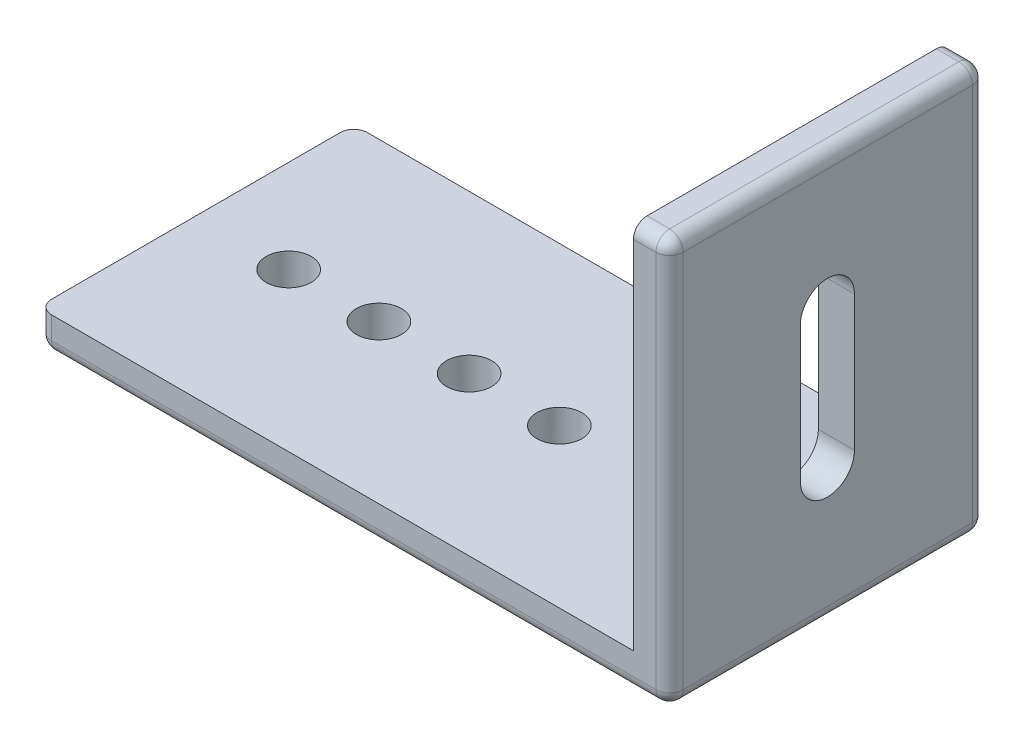
ISO-10303-21;
HEADER;
FILE_DESCRIPTION(('STEP AP214'),'2;1');
FILE_NAME('part.step','',(''),(''),'','','');
FILE_SCHEMA(('AUTOMOTIVE_DESIGN { 1 0 10303 214 1 1 1 1 }'));
ENDSEC;
DATA;
#1=APPLICATION_CONTEXT('core data for automotive mechanical design processes');
#2=APPLICATION_PROTOCOL_DEFINITION('international standard','automotive_design',2000,#1);
#3=PRODUCT_CONTEXT('',#1,'mechanical');
#4=PRODUCT('Part','Part','',(#3));
#5=PRODUCT_RELATED_PRODUCT_CATEGORY('part','',(#4));
#6=PRODUCT_DEFINITION_FORMATION('','',#4);
#7=PRODUCT_DEFINITION_CONTEXT('part definition',#1,'design');
#8=PRODUCT_DEFINITION('design','',#6,#7);
#9=PRODUCT_DEFINITION_SHAPE('','',#8);
#10=(LENGTH_UNIT() NAMED_UNIT(*) SI_UNIT(.MILLI.,.METRE.));
#11=(NAMED_UNIT(*) PLANE_ANGLE_UNIT() SI_UNIT($,.RADIAN.));
#12=(NAMED_UNIT(*) SI_UNIT($,.STERADIAN.) SOLID_ANGLE_UNIT());
#13=UNCERTAINTY_MEASURE_WITH_UNIT(LENGTH_MEASURE(1.E-05),#10,'distance_accuracy_value','');
#14=(GEOMETRIC_REPRESENTATION_CONTEXT(3) GLOBAL_UNCERTAINTY_ASSIGNED_CONTEXT((#13)) GLOBAL_UNIT_ASSIGNED_CONTEXT((#10,
#11,#12)) REPRESENTATION_CONTEXT('',''));
#15=CARTESIAN_POINT('',(0.,0.,0.));
#16=DIRECTION('',(0.,0.,1.));
#17=DIRECTION('',(1.,0.,0.));
#18=AXIS2_PLACEMENT_3D('',#15,#16,#17);
#19=CARTESIAN_POINT('',(70.,8.,35.));
#20=DIRECTION('',(-1.,0.,0.));
#21=DIRECTION('',(0.,0.,1.));
#22=AXIS2_PLACEMENT_3D('',#19,#20,#21);
#23=PLANE('',#22);
#24=DIRECTION('',(0.,-1.,0.));
#25=VECTOR('',#24,1.);
#26=CARTESIAN_POINT('',(70.,60.,6.));
#27=LINE('',#26,#25);
#28=CARTESIAN_POINT('',(70.,60.,6.));
#29=VERTEX_POINT('',#28);
#30=CARTESIAN_POINT('',(70.,30.,5.99999999999999));
#31=VERTEX_POINT('',#30);
#32=EDGE_CURVE('E190',#29,#31,#27,.T.);
#33=ORIENTED_EDGE('',*,*,#32,.F.);
#34=CARTESIAN_POINT('',(70.,60.,0.));
#35=DIRECTION('',(1.,0.,0.));
#36=DIRECTION('',(0.,0.,-1.));
#37=AXIS2_PLACEMENT_3D('',#34,#35,#36);
#38=CIRCLE('',#37,6.);
#39=CARTESIAN_POINT('',(70.,60.,-6.));
#40=VERTEX_POINT('',#39);
#41=EDGE_CURVE('E195',#40,#29,#38,.T.);
#42=ORIENTED_EDGE('',*,*,#41,.F.);
#43=DIRECTION('',(0.,1.,0.));
#44=VECTOR('',#43,1.);
#45=CARTESIAN_POINT('',(70.,60.,-6.));
#46=LINE('',#45,#44);
#47=CARTESIAN_POINT('',(70.,30.,-6.00000000000001));
#48=VERTEX_POINT('',#47);
#49=EDGE_CURVE('E199',#48,#40,#46,.T.);
#50=ORIENTED_EDGE('',*,*,#49,.F.);
#51=CARTESIAN_POINT('',(70.,30.,0.));
#52=DIRECTION('',(1.,0.,0.));
#53=DIRECTION('',(0.,0.,-1.));
#54=AXIS2_PLACEMENT_3D('',#51,#52,#53);
#55=CIRCLE('',#54,6.);
#56=EDGE_CURVE('E179',#31,#48,#55,.T.);
#57=ORIENTED_EDGE('',*,*,#56,.F.);
#58=EDGE_LOOP('',(#33,#42,#50,#57));
#59=FACE_BOUND('',#58,.T.);
#60=DIRECTION('',(0.,0.,1.));
#61=VECTOR('',#60,1.);
#62=CARTESIAN_POINT('',(70.,87.,35.));
#63=LINE('',#62,#61);
#64=CARTESIAN_POINT('',(70.,87.,-32.1580626756818));
#65=VERTEX_POINT('',#64);
#66=CARTESIAN_POINT('',(70.,87.,32.));
#67=VERTEX_POINT('',#66);
#68=EDGE_CURVE('E306',#65,#67,#63,.T.);
#69=ORIENTED_EDGE('',*,*,#68,.T.);
#70=DIRECTION('',(0.,-1.,0.));
#71=VECTOR('',#70,1.);
#72=CARTESIAN_POINT('',(70.,8.,32.));
#73=LINE('',#72,#71);
#74=CARTESIAN_POINT('',(70.,3.,32.));
#75=VERTEX_POINT('',#74);
#76=EDGE_CURVE('E310',#67,#75,#73,.T.);
#77=ORIENTED_EDGE('',*,*,#76,.T.);
#78=DIRECTION('',(0.,0.,-1.));
#79=VECTOR('',#78,1.);
#80=CARTESIAN_POINT('',(70.,3.,-35.1580626756818));
#81=LINE('',#80,#79);
#82=CARTESIAN_POINT('',(70.,3.,-32.1580626756818));
#83=VERTEX_POINT('',#82);
#84=EDGE_CURVE('E238',#75,#83,#81,.T.);
#85=ORIENTED_EDGE('',*,*,#84,.T.);
#86=DIRECTION('',(0.,1.,0.));
#87=VECTOR('',#86,1.);
#88=CARTESIAN_POINT('',(70.,90.,-32.1580626756818));
#89=LINE('',#88,#87);
#90=EDGE_CURVE('E308',#83,#65,#89,.T.);
#91=ORIENTED_EDGE('',*,*,#90,.T.);
#92=EDGE_LOOP('',(#69,#77,#85,#91));
#93=FACE_BOUND('',#92,.T.);
#94=ADVANCED_FACE('F35',(#59,#93),#23,.F.);
#95=CARTESIAN_POINT('',(-70.,8.,-35.));
#96=DIRECTION('',(0.,0.,1.));
#97=DIRECTION('',(1.,0.,0.));
#98=AXIS2_PLACEMENT_3D('',#95,#96,#97);
#99=PLANE('',#98);
#100=DIRECTION('',(-1.,0.,0.));
#101=VECTOR('',#100,1.);
#102=CARTESIAN_POINT('',(-70.,3.,-35.));
#103=LINE('',#102,#101);
#104=CARTESIAN_POINT('',(62.,3.,-35.));
#105=VERTEX_POINT('',#104);
#106=CARTESIAN_POINT('',(-67.,3.,-35.));
#107=VERTEX_POINT('',#106);
#108=EDGE_CURVE('E253',#105,#107,#103,.T.);
#109=ORIENTED_EDGE('',*,*,#108,.T.);
#110=DIRECTION('',(0.,-1.,0.));
#111=VECTOR('',#110,1.);
#112=CARTESIAN_POINT('',(-67.,8.,-35.));
#113=LINE('',#112,#111);
#114=CARTESIAN_POINT('',(-67.,8.,-35.));
#115=VERTEX_POINT('',#114);
#116=EDGE_CURVE('E51',#107,#115,#113,.F.);
#117=ORIENTED_EDGE('',*,*,#116,.T.);
#118=DIRECTION('',(-1.,0.,0.));
#119=VECTOR('',#118,1.);
#120=CARTESIAN_POINT('',(-70.,8.,-35.));
#121=LINE('',#120,#119);
#122=CARTESIAN_POINT('',(62.,8.,-35.));
#123=VERTEX_POINT('',#122);
#124=EDGE_CURVE('E225',#123,#115,#121,.T.);
#125=ORIENTED_EDGE('',*,*,#124,.F.);
#126=DIRECTION('',(0.,-1.,0.));
#127=VECTOR('',#126,1.);
#128=CARTESIAN_POINT('',(62.,8.,-35.));
#129=LINE('',#128,#127);
#130=EDGE_CURVE('E222',#123,#105,#129,.T.);
#131=ORIENTED_EDGE('',*,*,#130,.T.);
#132=EDGE_LOOP('',(#109,#117,#125,#131));
#133=FACE_BOUND('',#132,.T.);
#134=ADVANCED_FACE('F388',(#133),#99,.F.);
#135=CARTESIAN_POINT('',(-70.,8.,35.));
#136=DIRECTION('',(1.,0.,0.));
#137=DIRECTION('',(0.,0.,-1.));
#138=AXIS2_PLACEMENT_3D('',#135,#136,#137);
#139=PLANE('',#138);
#140=DIRECTION('',(0.,0.,1.));
#141=VECTOR('',#140,1.);
#142=CARTESIAN_POINT('',(-70.,8.,35.));
#143=LINE('',#142,#141);
#144=CARTESIAN_POINT('',(-70.,8.,-32.));
#145=VERTEX_POINT('',#144);
#146=CARTESIAN_POINT('',(-70.,8.,32.));
#147=VERTEX_POINT('',#146);
#148=EDGE_CURVE('E227',#145,#147,#143,.T.);
#149=ORIENTED_EDGE('',*,*,#148,.F.);
#150=DIRECTION('',(0.,-1.,0.));
#151=VECTOR('',#150,1.);
#152=CARTESIAN_POINT('',(-70.,8.,-32.));
#153=LINE('',#152,#151);
#154=CARTESIAN_POINT('',(-70.,3.,-32.));
#155=VERTEX_POINT('',#154);
#156=EDGE_CURVE('E312',#145,#155,#153,.T.);
#157=ORIENTED_EDGE('',*,*,#156,.T.);
#158=DIRECTION('',(0.,0.,1.));
#159=VECTOR('',#158,1.);
#160=CARTESIAN_POINT('',(-70.,3.,35.));
#161=LINE('',#160,#159);
#162=CARTESIAN_POINT('',(-70.,3.,32.));
#163=VERTEX_POINT('',#162);
#164=EDGE_CURVE('E255',#155,#163,#161,.T.);
#165=ORIENTED_EDGE('',*,*,#164,.T.);
#166=DIRECTION('',(0.,-1.,0.));
#167=VECTOR('',#166,1.);
#168=CARTESIAN_POINT('',(-70.,8.,32.));
#169=LINE('',#168,#167);
#170=EDGE_CURVE('E295',#163,#147,#169,.F.);
#171=ORIENTED_EDGE('',*,*,#170,.T.);
#172=EDGE_LOOP('',(#149,#157,#165,#171));
#173=FACE_BOUND('',#172,.T.);
#174=ADVANCED_FACE('F369',(#173),#139,.F.);
#175=CARTESIAN_POINT('',(-70.,8.,35.));
#176=DIRECTION('',(0.,0.,-1.));
#177=DIRECTION('',(-1.,0.,0.));
#178=AXIS2_PLACEMENT_3D('',#175,#176,#177);
#179=PLANE('',#178);
#180=DIRECTION('',(1.,0.,0.));
#181=VECTOR('',#180,1.);
#182=CARTESIAN_POINT('',(-70.,8.,35.));
#183=LINE('',#182,#181);
#184=CARTESIAN_POINT('',(-67.,8.,35.));
#185=VERTEX_POINT('',#184);
#186=CARTESIAN_POINT('',(62.,8.,35.));
#187=VERTEX_POINT('',#186);
#188=EDGE_CURVE('E229',#185,#187,#183,.T.);
#189=ORIENTED_EDGE('',*,*,#188,.F.);
#190=DIRECTION('',(0.,-1.,0.));
#191=VECTOR('',#190,1.);
#192=CARTESIAN_POINT('',(-67.,8.,35.));
#193=LINE('',#192,#191);
#194=CARTESIAN_POINT('',(-67.,3.,35.));
#195=VERTEX_POINT('',#194);
#196=EDGE_CURVE('E293',#185,#195,#193,.T.);
#197=ORIENTED_EDGE('',*,*,#196,.T.);
#198=DIRECTION('',(1.,0.,0.));
#199=VECTOR('',#198,1.);
#200=CARTESIAN_POINT('',(70.,3.,35.));
#201=LINE('',#200,#199);
#202=CARTESIAN_POINT('',(67.,3.,35.));
#203=VERTEX_POINT('',#202);
#204=EDGE_CURVE('E257',#195,#203,#201,.T.);
#205=ORIENTED_EDGE('',*,*,#204,.T.);
#206=DIRECTION('',(0.,-1.,0.));
#207=VECTOR('',#206,1.);
#208=CARTESIAN_POINT('',(67.,8.,35.));
#209=LINE('',#208,#207);
#210=CARTESIAN_POINT('',(67.,87.,35.));
#211=VERTEX_POINT('',#210);
#212=EDGE_CURVE('E289',#203,#211,#209,.F.);
#213=ORIENTED_EDGE('',*,*,#212,.T.);
#214=DIRECTION('',(1.,0.,0.));
#215=VECTOR('',#214,1.);
#216=CARTESIAN_POINT('',(62.,87.,35.));
#217=LINE('',#216,#215);
#218=CARTESIAN_POINT('',(62.,87.,35.));
#219=VERTEX_POINT('',#218);
#220=EDGE_CURVE('E291',#211,#219,#217,.F.);
#221=ORIENTED_EDGE('',*,*,#220,.T.);
#222=DIRECTION('',(0.,-1.,0.));
#223=VECTOR('',#222,1.);
#224=CARTESIAN_POINT('',(62.,0.,35.));
#225=LINE('',#224,#223);
#226=EDGE_CURVE('E206',#219,#187,#225,.T.);
#227=ORIENTED_EDGE('',*,*,#226,.T.);
#228=EDGE_LOOP('',(#189,#197,#205,#213,#221,#227));
#229=FACE_BOUND('',#228,.T.);
#230=ADVANCED_FACE('F378',(#229),#179,.F.);
#231=CARTESIAN_POINT('',(0.,8.,0.));
#232=DIRECTION('',(0.,-1.,0.));
#233=DIRECTION('',(0.,0.,-1.));
#234=AXIS2_PLACEMENT_3D('',#231,#232,#233);
#235=PLANE('',#234);
#236=CARTESIAN_POINT('',(-49.4277426908549,8.,0.));
#237=DIRECTION('',(0.,-1.,0.));
#238=DIRECTION('',(0.,0.,-1.));
#239=AXIS2_PLACEMENT_3D('',#236,#237,#238);
#240=CIRCLE('',#239,5.);
#241=CARTESIAN_POINT('',(-49.4277426908549,8.,-5.));
#242=VERTEX_POINT('',#241);
#243=EDGE_CURVE('E732',#242,#242,#240,.T.);
#244=ORIENTED_EDGE('',*,*,#243,.T.);
#245=EDGE_LOOP('',(#244));
#246=FACE_BOUND('',#245,.T.);
#247=CARTESIAN_POINT('',(-29.4277426908549,8.,0.));
#248=DIRECTION('',(0.,-1.,0.));
#249=DIRECTION('',(0.,0.,-1.));
#250=AXIS2_PLACEMENT_3D('',#247,#248,#249);
#251=CIRCLE('',#250,5.);
#252=CARTESIAN_POINT('',(-29.4277426908549,8.,-5.));
#253=VERTEX_POINT('',#252);
#254=EDGE_CURVE('E736',#253,#253,#251,.T.);
#255=ORIENTED_EDGE('',*,*,#254,.T.);
#256=EDGE_LOOP('',(#255));
#257=FACE_BOUND('',#256,.T.);
#258=CARTESIAN_POINT('',(10.5722573091451,8.,0.));
#259=DIRECTION('',(0.,-1.,0.));
#260=DIRECTION('',(0.,0.,-1.));
#261=AXIS2_PLACEMENT_3D('',#258,#259,#260);
#262=CIRCLE('',#261,5.);
#263=CARTESIAN_POINT('',(10.5722573091451,8.,-5.));
#264=VERTEX_POINT('',#263);
#265=EDGE_CURVE('E740',#264,#264,#262,.T.);
#266=ORIENTED_EDGE('',*,*,#265,.T.);
#267=EDGE_LOOP('',(#266));
#268=FACE_BOUND('',#267,.T.);
#269=CARTESIAN_POINT('',(-9.4277426908549,8.,0.));
#270=DIRECTION('',(0.,-1.,0.));
#271=DIRECTION('',(0.,0.,-1.));
#272=AXIS2_PLACEMENT_3D('',#269,#270,#271);
#273=CIRCLE('',#272,5.);
#274=CARTESIAN_POINT('',(-9.4277426908549,8.,-5.));
#275=VERTEX_POINT('',#274);
#276=EDGE_CURVE('E743',#275,#275,#273,.T.);
#277=ORIENTED_EDGE('',*,*,#276,.T.);
#278=EDGE_LOOP('',(#277));
#279=FACE_BOUND('',#278,.T.);
#280=ORIENTED_EDGE('',*,*,#124,.T.);
#281=CARTESIAN_POINT('',(-67.,8.,-32.));
#282=DIRECTION('',(0.,-1.,0.));
#283=DIRECTION('',(0.,0.,-1.));
#284=AXIS2_PLACEMENT_3D('',#281,#282,#283);
#285=CIRCLE('',#284,3.);
#286=EDGE_CURVE('E347',#115,#145,#285,.F.);
#287=ORIENTED_EDGE('',*,*,#286,.T.);
#288=ORIENTED_EDGE('',*,*,#148,.T.);
#289=CARTESIAN_POINT('',(-67.,8.,32.));
#290=DIRECTION('',(0.,-1.,0.));
#291=DIRECTION('',(0.,0.,-1.));
#292=AXIS2_PLACEMENT_3D('',#289,#290,#291);
#293=CIRCLE('',#292,3.);
#294=EDGE_CURVE('E298',#147,#185,#293,.F.);
#295=ORIENTED_EDGE('',*,*,#294,.T.);
#296=ORIENTED_EDGE('',*,*,#188,.T.);
#297=DIRECTION('',(0.,0.,-1.));
#298=VECTOR('',#297,1.);
#299=CARTESIAN_POINT('',(62.,8.,0.));
#300=LINE('',#299,#298);
#301=EDGE_CURVE('E220',#187,#123,#300,.T.);
#302=ORIENTED_EDGE('',*,*,#301,.T.);
#303=EDGE_LOOP('',(#280,#287,#288,#295,#296,#302));
#304=FACE_BOUND('',#303,.T.);
#305=ADVANCED_FACE('F367',(#246,#257,#268,#279,#304),#235,.F.);
#306=CARTESIAN_POINT('',(0.,0.,0.));
#307=DIRECTION('',(0.,-1.,0.));
#308=DIRECTION('',(0.,0.,-1.));
#309=AXIS2_PLACEMENT_3D('',#306,#307,#308);
#310=PLANE('',#309);
#311=CARTESIAN_POINT('',(-49.4277426908549,0.,0.));
#312=DIRECTION('',(0.,1.,0.));
#313=DIRECTION('',(0.,0.,1.));
#314=AXIS2_PLACEMENT_3D('',#311,#312,#313);
#315=CIRCLE('',#314,5.);
#316=CARTESIAN_POINT('',(-49.4277426908549,0.,5.));
#317=VERTEX_POINT('',#316);
#318=EDGE_CURVE('E316',#317,#317,#315,.T.);
#319=ORIENTED_EDGE('',*,*,#318,.T.);
#320=EDGE_LOOP('',(#319));
#321=FACE_BOUND('',#320,.T.);
#322=CARTESIAN_POINT('',(-29.4277426908549,0.,0.));
#323=DIRECTION('',(0.,1.,0.));
#324=DIRECTION('',(0.,0.,1.));
#325=AXIS2_PLACEMENT_3D('',#322,#323,#324);
#326=CIRCLE('',#325,5.);
#327=CARTESIAN_POINT('',(-29.4277426908549,0.,5.));
#328=VERTEX_POINT('',#327);
#329=EDGE_CURVE('E759',#328,#328,#326,.T.);
#330=ORIENTED_EDGE('',*,*,#329,.T.);
#331=EDGE_LOOP('',(#330));
#332=FACE_BOUND('',#331,.T.);
#333=CARTESIAN_POINT('',(10.5722573091451,0.,0.));
#334=DIRECTION('',(0.,1.,0.));
#335=DIRECTION('',(0.,0.,1.));
#336=AXIS2_PLACEMENT_3D('',#333,#334,#335);
#337=CIRCLE('',#336,5.);
#338=CARTESIAN_POINT('',(10.5722573091451,0.,5.));
#339=VERTEX_POINT('',#338);
#340=EDGE_CURVE('E749',#339,#339,#337,.T.);
#341=ORIENTED_EDGE('',*,*,#340,.T.);
#342=EDGE_LOOP('',(#341));
#343=FACE_BOUND('',#342,.T.);
#344=CARTESIAN_POINT('',(-9.4277426908549,0.,0.));
#345=DIRECTION('',(0.,1.,0.));
#346=DIRECTION('',(0.,0.,1.));
#347=AXIS2_PLACEMENT_3D('',#344,#345,#346);
#348=CIRCLE('',#347,5.);
#349=CARTESIAN_POINT('',(-9.4277426908549,0.,5.));
#350=VERTEX_POINT('',#349);
#351=EDGE_CURVE('E745',#350,#350,#348,.T.);
#352=ORIENTED_EDGE('',*,*,#351,.T.);
#353=EDGE_LOOP('',(#352));
#354=FACE_BOUND('',#353,.T.);
#355=DIRECTION('',(0.,0.,-1.));
#356=VECTOR('',#355,1.);
#357=CARTESIAN_POINT('',(62.,0.,35.));
#358=LINE('',#357,#356);
#359=CARTESIAN_POINT('',(62.,0.,-32.));
#360=VERTEX_POINT('',#359);
#361=CARTESIAN_POINT('',(62.,0.,-32.1580626756818));
#362=VERTEX_POINT('',#361);
#363=EDGE_CURVE('E211',#360,#362,#358,.T.);
#364=ORIENTED_EDGE('',*,*,#363,.T.);
#365=DIRECTION('',(1.,0.,0.));
#366=VECTOR('',#365,1.);
#367=CARTESIAN_POINT('',(0.,0.,-32.1580626756818));
#368=LINE('',#367,#366);
#369=CARTESIAN_POINT('',(67.,0.,-32.1580626756818));
#370=VERTEX_POINT('',#369);
#371=EDGE_CURVE('E275',#362,#370,#368,.T.);
#372=ORIENTED_EDGE('',*,*,#371,.T.);
#373=DIRECTION('',(0.,0.,-1.));
#374=VECTOR('',#373,1.);
#375=CARTESIAN_POINT('',(67.,0.,35.));
#376=LINE('',#375,#374);
#377=CARTESIAN_POINT('',(67.,0.,32.));
#378=VERTEX_POINT('',#377);
#379=EDGE_CURVE('E250',#370,#378,#376,.F.);
#380=ORIENTED_EDGE('',*,*,#379,.T.);
#381=DIRECTION('',(1.,0.,0.));
#382=VECTOR('',#381,1.);
#383=CARTESIAN_POINT('',(-70.,0.,32.));
#384=LINE('',#383,#382);
#385=CARTESIAN_POINT('',(-67.,0.,32.));
#386=VERTEX_POINT('',#385);
#387=EDGE_CURVE('E241',#378,#386,#384,.F.);
#388=ORIENTED_EDGE('',*,*,#387,.T.);
#389=DIRECTION('',(0.,0.,1.));
#390=VECTOR('',#389,1.);
#391=CARTESIAN_POINT('',(-67.,0.,-35.));
#392=LINE('',#391,#390);
#393=CARTESIAN_POINT('',(-67.,0.,-32.));
#394=VERTEX_POINT('',#393);
#395=EDGE_CURVE('E244',#386,#394,#392,.F.);
#396=ORIENTED_EDGE('',*,*,#395,.T.);
#397=DIRECTION('',(-1.,0.,0.));
#398=VECTOR('',#397,1.);
#399=CARTESIAN_POINT('',(62.,0.,-32.));
#400=LINE('',#399,#398);
#401=EDGE_CURVE('E247',#394,#360,#400,.F.);
#402=ORIENTED_EDGE('',*,*,#401,.T.);
#403=EDGE_LOOP('',(#364,#372,#380,#388,#396,#402));
#404=FACE_BOUND('',#403,.T.);
#405=ADVANCED_FACE('F357',(#321,#332,#343,#354,#404),#310,.T.);
#406=CARTESIAN_POINT('',(62.,0.,0.));
#407=DIRECTION('',(-1.,0.,0.));
#408=DIRECTION('',(0.,0.,1.));
#409=AXIS2_PLACEMENT_3D('',#406,#407,#408);
#410=PLANE('',#409);
#411=CARTESIAN_POINT('',(62.,60.,0.));
#412=DIRECTION('',(-1.,0.,0.));
#413=DIRECTION('',(0.,0.,1.));
#414=AXIS2_PLACEMENT_3D('',#411,#412,#413);
#415=CIRCLE('',#414,6.);
#416=CARTESIAN_POINT('',(62.,60.,6.));
#417=VERTEX_POINT('',#416);
#418=CARTESIAN_POINT('',(62.,60.,-6.));
#419=VERTEX_POINT('',#418);
#420=EDGE_CURVE('E236',#417,#419,#415,.T.);
#421=ORIENTED_EDGE('',*,*,#420,.F.);
#422=DIRECTION('',(0.,1.,0.));
#423=VECTOR('',#422,1.);
#424=CARTESIAN_POINT('',(62.,0.,5.99999999999998));
#425=LINE('',#424,#423);
#426=CARTESIAN_POINT('',(62.,30.,5.99999999999999));
#427=VERTEX_POINT('',#426);
#428=EDGE_CURVE('E231',#427,#417,#425,.T.);
#429=ORIENTED_EDGE('',*,*,#428,.F.);
#430=CARTESIAN_POINT('',(62.,30.,0.));
#431=DIRECTION('',(-1.,0.,0.));
#432=DIRECTION('',(0.,0.,1.));
#433=AXIS2_PLACEMENT_3D('',#430,#431,#432);
#434=CIRCLE('',#433,6.);
#435=CARTESIAN_POINT('',(62.,30.,-6.00000000000001));
#436=VERTEX_POINT('',#435);
#437=EDGE_CURVE('E182',#436,#427,#434,.T.);
#438=ORIENTED_EDGE('',*,*,#437,.F.);
#439=DIRECTION('',(0.,-1.,0.));
#440=VECTOR('',#439,1.);
#441=CARTESIAN_POINT('',(62.,0.,-6.00000000000002));
#442=LINE('',#441,#440);
#443=EDGE_CURVE('E234',#419,#436,#442,.T.);
#444=ORIENTED_EDGE('',*,*,#443,.F.);
#445=EDGE_LOOP('',(#421,#429,#438,#444));
#446=FACE_BOUND('',#445,.T.);
#447=DIRECTION('',(0.,1.,0.));
#448=VECTOR('',#447,1.);
#449=CARTESIAN_POINT('',(62.,0.,-35.1580626756818));
#450=LINE('',#449,#448);
#451=CARTESIAN_POINT('',(62.,3.,-35.1580626756818));
#452=VERTEX_POINT('',#451);
#453=CARTESIAN_POINT('',(62.,87.,-35.1580626756818));
#454=VERTEX_POINT('',#453);
#455=EDGE_CURVE('E214',#452,#454,#450,.T.);
#456=ORIENTED_EDGE('',*,*,#455,.F.);
#457=CARTESIAN_POINT('',(62.,3.,-32.1580626756818));
#458=DIRECTION('',(-1.,0.,0.));
#459=DIRECTION('',(0.,0.,1.));
#460=AXIS2_PLACEMENT_3D('',#457,#458,#459);
#461=CIRCLE('',#460,3.);
#462=EDGE_CURVE('E287',#452,#362,#461,.T.);
#463=ORIENTED_EDGE('',*,*,#462,.T.);
#464=ORIENTED_EDGE('',*,*,#363,.F.);
#465=CARTESIAN_POINT('',(62.,3.,-32.));
#466=DIRECTION('',(-1.,0.,0.));
#467=DIRECTION('',(0.,0.,1.));
#468=AXIS2_PLACEMENT_3D('',#465,#466,#467);
#469=CIRCLE('',#468,3.);
#470=EDGE_CURVE('E260',#360,#105,#469,.F.);
#471=ORIENTED_EDGE('',*,*,#470,.T.);
#472=ORIENTED_EDGE('',*,*,#130,.F.);
#473=ORIENTED_EDGE('',*,*,#301,.F.);
#474=ORIENTED_EDGE('',*,*,#226,.F.);
#475=CARTESIAN_POINT('',(62.,87.,32.));
#476=DIRECTION('',(-1.,0.,0.));
#477=DIRECTION('',(0.,0.,1.));
#478=AXIS2_PLACEMENT_3D('',#475,#476,#477);
#479=CIRCLE('',#478,3.);
#480=CARTESIAN_POINT('',(62.,90.,32.));
#481=VERTEX_POINT('',#480);
#482=EDGE_CURVE('E283',#219,#481,#479,.T.);
#483=ORIENTED_EDGE('',*,*,#482,.T.);
#484=DIRECTION('',(0.,0.,1.));
#485=VECTOR('',#484,1.);
#486=CARTESIAN_POINT('',(62.,90.,35.));
#487=LINE('',#486,#485);
#488=CARTESIAN_POINT('',(62.,90.,-32.1580626756818));
#489=VERTEX_POINT('',#488);
#490=EDGE_CURVE('E217',#489,#481,#487,.T.);
#491=ORIENTED_EDGE('',*,*,#490,.F.);
#492=CARTESIAN_POINT('',(62.,87.,-32.1580626756818));
#493=DIRECTION('',(-1.,0.,0.));
#494=DIRECTION('',(0.,0.,1.));
#495=AXIS2_PLACEMENT_3D('',#492,#493,#494);
#496=CIRCLE('',#495,3.);
#497=EDGE_CURVE('E285',#489,#454,#496,.T.);
#498=ORIENTED_EDGE('',*,*,#497,.T.);
#499=EDGE_LOOP('',(#456,#463,#464,#471,#472,#473,#474,#483,#491,#498));
#500=FACE_BOUND('',#499,.T.);
#501=ADVANCED_FACE('F387',(#446,#500),#410,.T.);
#502=CARTESIAN_POINT('',(62.,90.,35.));
#503=DIRECTION('',(0.,1.,0.));
#504=DIRECTION('',(0.,0.,1.));
#505=AXIS2_PLACEMENT_3D('',#502,#503,#504);
#506=PLANE('',#505);
#507=DIRECTION('',(0.,0.,1.));
#508=VECTOR('',#507,1.);
#509=CARTESIAN_POINT('',(67.,90.,-35.1580626756818));
#510=LINE('',#509,#508);
#511=CARTESIAN_POINT('',(67.,90.,32.));
#512=VERTEX_POINT('',#511);
#513=CARTESIAN_POINT('',(67.,90.,-32.1580626756818));
#514=VERTEX_POINT('',#513);
#515=EDGE_CURVE('E300',#512,#514,#510,.F.);
#516=ORIENTED_EDGE('',*,*,#515,.T.);
#517=DIRECTION('',(1.,0.,0.));
#518=VECTOR('',#517,1.);
#519=CARTESIAN_POINT('',(62.,90.,-32.1580626756818));
#520=LINE('',#519,#518);
#521=EDGE_CURVE('E304',#514,#489,#520,.F.);
#522=ORIENTED_EDGE('',*,*,#521,.T.);
#523=ORIENTED_EDGE('',*,*,#490,.T.);
#524=DIRECTION('',(1.,0.,0.));
#525=VECTOR('',#524,1.);
#526=CARTESIAN_POINT('',(70.,90.,32.));
#527=LINE('',#526,#525);
#528=EDGE_CURVE('E302',#481,#512,#527,.T.);
#529=ORIENTED_EDGE('',*,*,#528,.T.);
#530=EDGE_LOOP('',(#516,#522,#523,#529));
#531=FACE_BOUND('',#530,.T.);
#532=ADVANCED_FACE('F595',(#531),#506,.T.);
#533=CARTESIAN_POINT('',(62.,0.,-35.1580626756818));
#534=DIRECTION('',(0.,0.,-1.));
#535=DIRECTION('',(-1.,0.,0.));
#536=AXIS2_PLACEMENT_3D('',#533,#534,#535);
#537=PLANE('',#536);
#538=DIRECTION('',(0.,1.,0.));
#539=VECTOR('',#538,1.);
#540=CARTESIAN_POINT('',(67.,3.,-35.1580626756818));
#541=LINE('',#540,#539);
#542=CARTESIAN_POINT('',(67.,87.,-35.1580626756818));
#543=VERTEX_POINT('',#542);
#544=CARTESIAN_POINT('',(67.,3.,-35.1580626756818));
#545=VERTEX_POINT('',#544);
#546=EDGE_CURVE('E277',#543,#545,#541,.F.);
#547=ORIENTED_EDGE('',*,*,#546,.T.);
#548=DIRECTION('',(1.,0.,0.));
#549=VECTOR('',#548,1.);
#550=CARTESIAN_POINT('',(62.,3.,-35.1580626756818));
#551=LINE('',#550,#549);
#552=EDGE_CURVE('E281',#545,#452,#551,.F.);
#553=ORIENTED_EDGE('',*,*,#552,.T.);
#554=ORIENTED_EDGE('',*,*,#455,.T.);
#555=DIRECTION('',(1.,0.,0.));
#556=VECTOR('',#555,1.);
#557=CARTESIAN_POINT('',(62.,87.,-35.1580626756818));
#558=LINE('',#557,#556);
#559=EDGE_CURVE('E279',#454,#543,#558,.T.);
#560=ORIENTED_EDGE('',*,*,#559,.T.);
#561=EDGE_LOOP('',(#547,#553,#554,#560));
#562=FACE_BOUND('',#561,.T.);
#563=ADVANCED_FACE('F588',(#562),#537,.T.);
#564=CARTESIAN_POINT('',(-70.,60.,0.));
#565=DIRECTION('',(1.,0.,0.));
#566=DIRECTION('',(0.,0.,-1.));
#567=AXIS2_PLACEMENT_3D('',#564,#565,#566);
#568=CYLINDRICAL_SURFACE('',#567,6.);
#569=ORIENTED_EDGE('',*,*,#420,.T.);
#570=DIRECTION('',(1.,0.,0.));
#571=VECTOR('',#570,1.);
#572=CARTESIAN_POINT('',(-70.,60.,-6.));
#573=LINE('',#572,#571);
#574=EDGE_CURVE('E204',#419,#40,#573,.T.);
#575=ORIENTED_EDGE('',*,*,#574,.T.);
#576=ORIENTED_EDGE('',*,*,#41,.T.);
#577=DIRECTION('',(1.,0.,0.));
#578=VECTOR('',#577,1.);
#579=CARTESIAN_POINT('',(-70.,60.,6.));
#580=LINE('',#579,#578);
#581=EDGE_CURVE('E186',#417,#29,#580,.T.);
#582=ORIENTED_EDGE('',*,*,#581,.F.);
#583=EDGE_LOOP('',(#569,#575,#576,#582));
#584=FACE_BOUND('',#583,.T.);
#585=ADVANCED_FACE('F580',(#584),#568,.F.);
#586=CARTESIAN_POINT('',(-70.,60.,-6.));
#587=DIRECTION('',(0.,0.,-1.));
#588=DIRECTION('',(0.,1.,0.));
#589=AXIS2_PLACEMENT_3D('',#586,#587,#588);
#590=PLANE('',#589);
#591=ORIENTED_EDGE('',*,*,#443,.T.);
#592=DIRECTION('',(1.,0.,0.));
#593=VECTOR('',#592,1.);
#594=CARTESIAN_POINT('',(-70.,30.,-6.00000000000001));
#595=LINE('',#594,#593);
#596=EDGE_CURVE('E185',#436,#48,#595,.T.);
#597=ORIENTED_EDGE('',*,*,#596,.T.);
#598=ORIENTED_EDGE('',*,*,#49,.T.);
#599=ORIENTED_EDGE('',*,*,#574,.F.);
#600=EDGE_LOOP('',(#591,#597,#598,#599));
#601=FACE_BOUND('',#600,.T.);
#602=ADVANCED_FACE('F573',(#601),#590,.F.);
#603=CARTESIAN_POINT('',(-70.,30.,0.));
#604=DIRECTION('',(1.,0.,0.));
#605=DIRECTION('',(0.,0.,-1.));
#606=AXIS2_PLACEMENT_3D('',#603,#604,#605);
#607=CYLINDRICAL_SURFACE('',#606,6.);
#608=ORIENTED_EDGE('',*,*,#437,.T.);
#609=DIRECTION('',(1.,0.,0.));
#610=VECTOR('',#609,1.);
#611=CARTESIAN_POINT('',(-70.,30.,5.99999999999999));
#612=LINE('',#611,#610);
#613=EDGE_CURVE('E174',#427,#31,#612,.T.);
#614=ORIENTED_EDGE('',*,*,#613,.T.);
#615=ORIENTED_EDGE('',*,*,#56,.T.);
#616=ORIENTED_EDGE('',*,*,#596,.F.);
#617=EDGE_LOOP('',(#608,#614,#615,#616));
#618=FACE_BOUND('',#617,.T.);
#619=ADVANCED_FACE('F176',(#618),#607,.F.);
#620=CARTESIAN_POINT('',(-70.,60.,6.));
#621=DIRECTION('',(0.,0.,1.));
#622=DIRECTION('',(0.,-1.,0.));
#623=AXIS2_PLACEMENT_3D('',#620,#621,#622);
#624=PLANE('',#623);
#625=ORIENTED_EDGE('',*,*,#428,.T.);
#626=ORIENTED_EDGE('',*,*,#581,.T.);
#627=ORIENTED_EDGE('',*,*,#32,.T.);
#628=ORIENTED_EDGE('',*,*,#613,.F.);
#629=EDGE_LOOP('',(#625,#626,#627,#628));
#630=FACE_BOUND('',#629,.T.);
#631=ADVANCED_FACE('F191',(#630),#624,.F.);
#632=CARTESIAN_POINT('',(-9.4277426908549,0.,0.));
#633=DIRECTION('',(0.,1.,0.));
#634=DIRECTION('',(0.,0.,1.));
#635=AXIS2_PLACEMENT_3D('',#632,#633,#634);
#636=CYLINDRICAL_SURFACE('',#635,5.);
#637=ORIENTED_EDGE('',*,*,#351,.F.);
#638=EDGE_LOOP('',(#637));
#639=FACE_BOUND('',#638,.T.);
#640=ORIENTED_EDGE('',*,*,#276,.F.);
#641=EDGE_LOOP('',(#640));
#642=FACE_BOUND('',#641,.T.);
#643=ADVANCED_FACE('F552',(#639,#642),#636,.F.);
#644=CARTESIAN_POINT('',(10.5722573091451,0.,0.));
#645=DIRECTION('',(0.,1.,0.));
#646=DIRECTION('',(0.,0.,1.));
#647=AXIS2_PLACEMENT_3D('',#644,#645,#646);
#648=CYLINDRICAL_SURFACE('',#647,5.);
#649=ORIENTED_EDGE('',*,*,#340,.F.);
#650=EDGE_LOOP('',(#649));
#651=FACE_BOUND('',#650,.T.);
#652=ORIENTED_EDGE('',*,*,#265,.F.);
#653=EDGE_LOOP('',(#652));
#654=FACE_BOUND('',#653,.T.);
#655=ADVANCED_FACE('F544',(#651,#654),#648,.F.);
#656=CARTESIAN_POINT('',(-29.4277426908549,0.,0.));
#657=DIRECTION('',(0.,1.,0.));
#658=DIRECTION('',(0.,0.,1.));
#659=AXIS2_PLACEMENT_3D('',#656,#657,#658);
#660=CYLINDRICAL_SURFACE('',#659,5.);
#661=ORIENTED_EDGE('',*,*,#329,.F.);
#662=EDGE_LOOP('',(#661));
#663=FACE_BOUND('',#662,.T.);
#664=ORIENTED_EDGE('',*,*,#254,.F.);
#665=EDGE_LOOP('',(#664));
#666=FACE_BOUND('',#665,.T.);
#667=ADVANCED_FACE('F535',(#663,#666),#660,.F.);
#668=CARTESIAN_POINT('',(-49.4277426908549,0.,0.));
#669=DIRECTION('',(0.,1.,0.));
#670=DIRECTION('',(0.,0.,1.));
#671=AXIS2_PLACEMENT_3D('',#668,#669,#670);
#672=CYLINDRICAL_SURFACE('',#671,5.);
#673=ORIENTED_EDGE('',*,*,#318,.F.);
#674=EDGE_LOOP('',(#673));
#675=FACE_BOUND('',#674,.T.);
#676=ORIENTED_EDGE('',*,*,#243,.F.);
#677=EDGE_LOOP('',(#676));
#678=FACE_BOUND('',#677,.T.);
#679=ADVANCED_FACE('F411',(#675,#678),#672,.F.);
#680=CARTESIAN_POINT('',(-70.,3.,-32.));
#681=DIRECTION('',(1.,0.,0.));
#682=DIRECTION('',(0.,0.,-1.));
#683=AXIS2_PLACEMENT_3D('',#680,#681,#682);
#684=CYLINDRICAL_SURFACE('',#683,3.);
#685=ORIENTED_EDGE('',*,*,#401,.F.);
#686=CARTESIAN_POINT('',(-67.,3.,-32.));
#687=DIRECTION('',(1.,0.,0.));
#688=DIRECTION('',(0.,0.,-1.));
#689=AXIS2_PLACEMENT_3D('',#686,#687,#688);
#690=CIRCLE('',#689,3.);
#691=EDGE_CURVE('E11',#394,#107,#690,.T.);
#692=ORIENTED_EDGE('',*,*,#691,.T.);
#693=ORIENTED_EDGE('',*,*,#108,.F.);
#694=ORIENTED_EDGE('',*,*,#470,.F.);
#695=EDGE_LOOP('',(#685,#692,#693,#694));
#696=FACE_BOUND('',#695,.T.);
#697=ADVANCED_FACE('F360',(#696),#684,.T.);
#698=CARTESIAN_POINT('',(-67.,3.,35.));
#699=DIRECTION('',(0.,0.,-1.));
#700=DIRECTION('',(-1.,0.,0.));
#701=AXIS2_PLACEMENT_3D('',#698,#699,#700);
#702=CYLINDRICAL_SURFACE('',#701,3.);
#703=ORIENTED_EDGE('',*,*,#164,.F.);
#704=CARTESIAN_POINT('',(-67.,3.,-32.));
#705=DIRECTION('',(0.,0.,-1.));
#706=DIRECTION('',(-1.,0.,0.));
#707=AXIS2_PLACEMENT_3D('',#704,#705,#706);
#708=CIRCLE('',#707,3.);
#709=EDGE_CURVE('E44',#155,#394,#708,.F.);
#710=ORIENTED_EDGE('',*,*,#709,.T.);
#711=ORIENTED_EDGE('',*,*,#395,.F.);
#712=CARTESIAN_POINT('',(-67.,3.,32.));
#713=DIRECTION('',(0.,0.,-1.));
#714=DIRECTION('',(-1.,0.,0.));
#715=AXIS2_PLACEMENT_3D('',#712,#713,#714);
#716=CIRCLE('',#715,3.);
#717=EDGE_CURVE('E267',#386,#163,#716,.T.);
#718=ORIENTED_EDGE('',*,*,#717,.T.);
#719=EDGE_LOOP('',(#703,#710,#711,#718));
#720=FACE_BOUND('',#719,.T.);
#721=ADVANCED_FACE('F353',(#720),#702,.T.);
#722=CARTESIAN_POINT('',(-70.,3.,32.));
#723=DIRECTION('',(-1.,0.,0.));
#724=DIRECTION('',(0.,0.,1.));
#725=AXIS2_PLACEMENT_3D('',#722,#723,#724);
#726=CYLINDRICAL_SURFACE('',#725,3.);
#727=ORIENTED_EDGE('',*,*,#204,.F.);
#728=CARTESIAN_POINT('',(-67.,3.,32.));
#729=DIRECTION('',(-1.,0.,0.));
#730=DIRECTION('',(0.,0.,1.));
#731=AXIS2_PLACEMENT_3D('',#728,#729,#730);
#732=CIRCLE('',#731,3.);
#733=EDGE_CURVE('E264',#195,#386,#732,.F.);
#734=ORIENTED_EDGE('',*,*,#733,.T.);
#735=ORIENTED_EDGE('',*,*,#387,.F.);
#736=CARTESIAN_POINT('',(67.,3.,32.));
#737=DIRECTION('',(-1.,0.,0.));
#738=DIRECTION('',(0.,0.,1.));
#739=AXIS2_PLACEMENT_3D('',#736,#737,#738);
#740=CIRCLE('',#739,3.);
#741=EDGE_CURVE('E262',#378,#203,#740,.T.);
#742=ORIENTED_EDGE('',*,*,#741,.T.);
#743=EDGE_LOOP('',(#727,#734,#735,#742));
#744=FACE_BOUND('',#743,.T.);
#745=ADVANCED_FACE('F402',(#744),#726,.T.);
#746=CARTESIAN_POINT('',(67.,3.,35.));
#747=DIRECTION('',(0.,0.,1.));
#748=DIRECTION('',(1.,0.,0.));
#749=AXIS2_PLACEMENT_3D('',#746,#747,#748);
#750=CYLINDRICAL_SURFACE('',#749,3.);
#751=ORIENTED_EDGE('',*,*,#84,.F.);
#752=CARTESIAN_POINT('',(67.,3.,32.));
#753=DIRECTION('',(0.,0.,1.));
#754=DIRECTION('',(1.,0.,0.));
#755=AXIS2_PLACEMENT_3D('',#752,#753,#754);
#756=CIRCLE('',#755,3.);
#757=EDGE_CURVE('E272',#75,#378,#756,.F.);
#758=ORIENTED_EDGE('',*,*,#757,.T.);
#759=ORIENTED_EDGE('',*,*,#379,.F.);
#760=CARTESIAN_POINT('',(67.,3.,-32.1580626756818));
#761=DIRECTION('',(0.,0.,1.));
#762=DIRECTION('',(1.,0.,0.));
#763=AXIS2_PLACEMENT_3D('',#760,#761,#762);
#764=CIRCLE('',#763,3.);
#765=EDGE_CURVE('E270',#370,#83,#764,.T.);
#766=ORIENTED_EDGE('',*,*,#765,.T.);
#767=EDGE_LOOP('',(#751,#758,#759,#766));
#768=FACE_BOUND('',#767,.T.);
#769=ADVANCED_FACE('F399',(#768),#750,.T.);
#770=CARTESIAN_POINT('',(-67.,8.,32.));
#771=DIRECTION('',(0.,-1.,0.));
#772=DIRECTION('',(0.,0.,-1.));
#773=AXIS2_PLACEMENT_3D('',#770,#771,#772);
#774=CYLINDRICAL_SURFACE('',#773,3.);
#775=ORIENTED_EDGE('',*,*,#294,.F.);
#776=ORIENTED_EDGE('',*,*,#170,.F.);
#777=CARTESIAN_POINT('',(-67.,3.,32.));
#778=DIRECTION('',(0.,-1.,0.));
#779=DIRECTION('',(0.,0.,-1.));
#780=AXIS2_PLACEMENT_3D('',#777,#778,#779);
#781=CIRCLE('',#780,3.);
#782=EDGE_CURVE('E313',#195,#163,#781,.T.);
#783=ORIENTED_EDGE('',*,*,#782,.F.);
#784=ORIENTED_EDGE('',*,*,#196,.F.);
#785=EDGE_LOOP('',(#775,#776,#783,#784));
#786=FACE_BOUND('',#785,.T.);
#787=ADVANCED_FACE('F375',(#786),#774,.T.);
#788=CARTESIAN_POINT('',(-67.,3.,32.));
#789=DIRECTION('',(0.,0.,1.));
#790=DIRECTION('',(1.,0.,0.));
#791=AXIS2_PLACEMENT_3D('',#788,#789,#790);
#792=SPHERICAL_SURFACE('',#791,3.);
#793=ORIENTED_EDGE('',*,*,#782,.T.);
#794=ORIENTED_EDGE('',*,*,#717,.F.);
#795=ORIENTED_EDGE('',*,*,#733,.F.);
#796=EDGE_LOOP('',(#793,#794,#795));
#797=FACE_BOUND('',#796,.T.);
#798=ADVANCED_FACE('F412',(#797),#792,.T.);
#799=CARTESIAN_POINT('',(0.,3.,-32.1580626756818));
#800=DIRECTION('',(1.,0.,0.));
#801=DIRECTION('',(0.,0.,-1.));
#802=AXIS2_PLACEMENT_3D('',#799,#800,#801);
#803=CYLINDRICAL_SURFACE('',#802,3.);
#804=CARTESIAN_POINT('',(67.,3.,-32.1580626756818));
#805=DIRECTION('',(1.,0.,0.));
#806=DIRECTION('',(0.,0.,-1.));
#807=AXIS2_PLACEMENT_3D('',#804,#805,#806);
#808=CIRCLE('',#807,3.);
#809=EDGE_CURVE('E317',#370,#545,#808,.T.);
#810=ORIENTED_EDGE('',*,*,#809,.F.);
#811=ORIENTED_EDGE('',*,*,#371,.F.);
#812=ORIENTED_EDGE('',*,*,#462,.F.);
#813=ORIENTED_EDGE('',*,*,#552,.F.);
#814=EDGE_LOOP('',(#810,#811,#812,#813));
#815=FACE_BOUND('',#814,.T.);
#816=ADVANCED_FACE('F415',(#815),#803,.T.);
#817=CARTESIAN_POINT('',(67.,3.,-32.1580626756818));
#818=DIRECTION('',(0.,0.,-1.));
#819=DIRECTION('',(-1.,0.,0.));
#820=AXIS2_PLACEMENT_3D('',#817,#818,#819);
#821=SPHERICAL_SURFACE('',#820,3.);
#822=ORIENTED_EDGE('',*,*,#765,.F.);
#823=ORIENTED_EDGE('',*,*,#809,.T.);
#824=CARTESIAN_POINT('',(67.,3.,-32.1580626756818));
#825=DIRECTION('',(0.,1.,0.));
#826=DIRECTION('',(0.,0.,1.));
#827=AXIS2_PLACEMENT_3D('',#824,#825,#826);
#828=CIRCLE('',#827,3.);
#829=EDGE_CURVE('E339',#83,#545,#828,.T.);
#830=ORIENTED_EDGE('',*,*,#829,.F.);
#831=EDGE_LOOP('',(#822,#823,#830));
#832=FACE_BOUND('',#831,.T.);
#833=ADVANCED_FACE('F450',(#832),#821,.T.);
#834=CARTESIAN_POINT('',(62.,87.,-32.1580626756818));
#835=DIRECTION('',(1.,0.,0.));
#836=DIRECTION('',(0.,0.,-1.));
#837=AXIS2_PLACEMENT_3D('',#834,#835,#836);
#838=CYLINDRICAL_SURFACE('',#837,3.);
#839=ORIENTED_EDGE('',*,*,#497,.F.);
#840=ORIENTED_EDGE('',*,*,#521,.F.);
#841=CARTESIAN_POINT('',(67.,87.,-32.1580626756818));
#842=DIRECTION('',(1.,0.,0.));
#843=DIRECTION('',(0.,0.,-1.));
#844=AXIS2_PLACEMENT_3D('',#841,#842,#843);
#845=CIRCLE('',#844,3.);
#846=EDGE_CURVE('E336',#543,#514,#845,.T.);
#847=ORIENTED_EDGE('',*,*,#846,.F.);
#848=ORIENTED_EDGE('',*,*,#559,.F.);
#849=EDGE_LOOP('',(#839,#840,#847,#848));
#850=FACE_BOUND('',#849,.T.);
#851=ADVANCED_FACE('F446',(#850),#838,.T.);
#852=CARTESIAN_POINT('',(67.,8.,-32.1580626756818));
#853=DIRECTION('',(0.,-1.,0.));
#854=DIRECTION('',(0.,0.,-1.));
#855=AXIS2_PLACEMENT_3D('',#852,#853,#854);
#856=CYLINDRICAL_SURFACE('',#855,3.);
#857=ORIENTED_EDGE('',*,*,#829,.T.);
#858=ORIENTED_EDGE('',*,*,#546,.F.);
#859=CARTESIAN_POINT('',(67.,87.,-32.1580626756818));
#860=DIRECTION('',(0.,1.,0.));
#861=DIRECTION('',(0.,0.,1.));
#862=AXIS2_PLACEMENT_3D('',#859,#860,#861);
#863=CIRCLE('',#862,3.);
#864=EDGE_CURVE('E333',#65,#543,#863,.T.);
#865=ORIENTED_EDGE('',*,*,#864,.F.);
#866=ORIENTED_EDGE('',*,*,#90,.F.);
#867=EDGE_LOOP('',(#857,#858,#865,#866));
#868=FACE_BOUND('',#867,.T.);
#869=ADVANCED_FACE('F442',(#868),#856,.T.);
#870=CARTESIAN_POINT('',(67.,87.,-32.1580626756818));
#871=DIRECTION('',(0.,0.,1.));
#872=DIRECTION('',(1.,0.,0.));
#873=AXIS2_PLACEMENT_3D('',#870,#871,#872);
#874=SPHERICAL_SURFACE('',#873,3.);
#875=ORIENTED_EDGE('',*,*,#864,.T.);
#876=ORIENTED_EDGE('',*,*,#846,.T.);
#877=CARTESIAN_POINT('',(67.,87.,-32.1580626756818));
#878=DIRECTION('',(0.,0.,-1.));
#879=DIRECTION('',(-1.,0.,0.));
#880=AXIS2_PLACEMENT_3D('',#877,#878,#879);
#881=CIRCLE('',#880,3.);
#882=EDGE_CURVE('E330',#65,#514,#881,.F.);
#883=ORIENTED_EDGE('',*,*,#882,.F.);
#884=EDGE_LOOP('',(#875,#876,#883));
#885=FACE_BOUND('',#884,.T.);
#886=ADVANCED_FACE('F438',(#885),#874,.T.);
#887=CARTESIAN_POINT('',(62.,87.,32.));
#888=DIRECTION('',(-1.,0.,0.));
#889=DIRECTION('',(0.,0.,1.));
#890=AXIS2_PLACEMENT_3D('',#887,#888,#889);
#891=CYLINDRICAL_SURFACE('',#890,3.);
#892=ORIENTED_EDGE('',*,*,#482,.F.);
#893=ORIENTED_EDGE('',*,*,#220,.F.);
#894=CARTESIAN_POINT('',(67.,87.,32.));
#895=DIRECTION('',(1.,0.,0.));
#896=DIRECTION('',(0.,0.,-1.));
#897=AXIS2_PLACEMENT_3D('',#894,#895,#896);
#898=CIRCLE('',#897,3.);
#899=EDGE_CURVE('E327',#512,#211,#898,.T.);
#900=ORIENTED_EDGE('',*,*,#899,.F.);
#901=ORIENTED_EDGE('',*,*,#528,.F.);
#902=EDGE_LOOP('',(#892,#893,#900,#901));
#903=FACE_BOUND('',#902,.T.);
#904=ADVANCED_FACE('F434',(#903),#891,.T.);
#905=CARTESIAN_POINT('',(67.,87.,35.));
#906=DIRECTION('',(0.,0.,-1.));
#907=DIRECTION('',(-1.,0.,0.));
#908=AXIS2_PLACEMENT_3D('',#905,#906,#907);
#909=CYLINDRICAL_SURFACE('',#908,3.);
#910=ORIENTED_EDGE('',*,*,#882,.T.);
#911=ORIENTED_EDGE('',*,*,#515,.F.);
#912=CARTESIAN_POINT('',(67.,87.,32.));
#913=DIRECTION('',(0.,0.,1.));
#914=DIRECTION('',(1.,0.,0.));
#915=AXIS2_PLACEMENT_3D('',#912,#913,#914);
#916=CIRCLE('',#915,3.);
#917=EDGE_CURVE('E324',#67,#512,#916,.T.);
#918=ORIENTED_EDGE('',*,*,#917,.F.);
#919=ORIENTED_EDGE('',*,*,#68,.F.);
#920=EDGE_LOOP('',(#910,#911,#918,#919));
#921=FACE_BOUND('',#920,.T.);
#922=ADVANCED_FACE('F430',(#921),#909,.T.);
#923=CARTESIAN_POINT('',(67.,87.,32.));
#924=DIRECTION('',(0.,0.,1.));
#925=DIRECTION('',(1.,0.,0.));
#926=AXIS2_PLACEMENT_3D('',#923,#924,#925);
#927=SPHERICAL_SURFACE('',#926,3.);
#928=ORIENTED_EDGE('',*,*,#917,.T.);
#929=ORIENTED_EDGE('',*,*,#899,.T.);
#930=CARTESIAN_POINT('',(67.,87.,32.));
#931=DIRECTION('',(0.,1.,0.));
#932=DIRECTION('',(0.,0.,1.));
#933=AXIS2_PLACEMENT_3D('',#930,#931,#932);
#934=CIRCLE('',#933,3.);
#935=EDGE_CURVE('E321',#67,#211,#934,.F.);
#936=ORIENTED_EDGE('',*,*,#935,.F.);
#937=EDGE_LOOP('',(#928,#929,#936));
#938=FACE_BOUND('',#937,.T.);
#939=ADVANCED_FACE('F426',(#938),#927,.T.);
#940=CARTESIAN_POINT('',(67.,8.,32.));
#941=DIRECTION('',(0.,-1.,0.));
#942=DIRECTION('',(0.,0.,-1.));
#943=AXIS2_PLACEMENT_3D('',#940,#941,#942);
#944=CYLINDRICAL_SURFACE('',#943,3.);
#945=ORIENTED_EDGE('',*,*,#935,.T.);
#946=ORIENTED_EDGE('',*,*,#212,.F.);
#947=CARTESIAN_POINT('',(67.,3.,32.));
#948=DIRECTION('',(0.,-1.,0.));
#949=DIRECTION('',(0.,0.,-1.));
#950=AXIS2_PLACEMENT_3D('',#947,#948,#949);
#951=CIRCLE('',#950,3.);
#952=EDGE_CURVE('E318',#75,#203,#951,.T.);
#953=ORIENTED_EDGE('',*,*,#952,.F.);
#954=ORIENTED_EDGE('',*,*,#76,.F.);
#955=EDGE_LOOP('',(#945,#946,#953,#954));
#956=FACE_BOUND('',#955,.T.);
#957=ADVANCED_FACE('F422',(#956),#944,.T.);
#958=CARTESIAN_POINT('',(67.,3.,32.));
#959=DIRECTION('',(0.,0.,1.));
#960=DIRECTION('',(1.,0.,0.));
#961=AXIS2_PLACEMENT_3D('',#958,#959,#960);
#962=SPHERICAL_SURFACE('',#961,3.);
#963=ORIENTED_EDGE('',*,*,#952,.T.);
#964=ORIENTED_EDGE('',*,*,#741,.F.);
#965=ORIENTED_EDGE('',*,*,#757,.F.);
#966=EDGE_LOOP('',(#963,#964,#965));
#967=FACE_BOUND('',#966,.T.);
#968=ADVANCED_FACE('F419',(#967),#962,.T.);
#969=CARTESIAN_POINT('',(-67.,3.,-32.));
#970=DIRECTION('',(0.,0.,1.));
#971=DIRECTION('',(1.,0.,0.));
#972=AXIS2_PLACEMENT_3D('',#969,#970,#971);
#973=SPHERICAL_SURFACE('',#972,3.);
#974=ORIENTED_EDGE('',*,*,#691,.F.);
#975=ORIENTED_EDGE('',*,*,#709,.F.);
#976=CARTESIAN_POINT('',(-67.,3.,-32.));
#977=DIRECTION('',(0.,1.,0.));
#978=DIRECTION('',(0.,0.,1.));
#979=AXIS2_PLACEMENT_3D('',#976,#977,#978);
#980=CIRCLE('',#979,3.);
#981=EDGE_CURVE('E39',#107,#155,#980,.T.);
#982=ORIENTED_EDGE('',*,*,#981,.F.);
#983=EDGE_LOOP('',(#974,#975,#982));
#984=FACE_BOUND('',#983,.T.);
#985=ADVANCED_FACE('F37',(#984),#973,.T.);
#986=CARTESIAN_POINT('',(-67.,8.,-32.));
#987=DIRECTION('',(0.,-1.,0.));
#988=DIRECTION('',(0.,0.,-1.));
#989=AXIS2_PLACEMENT_3D('',#986,#987,#988);
#990=CYLINDRICAL_SURFACE('',#989,3.);
#991=ORIENTED_EDGE('',*,*,#286,.F.);
#992=ORIENTED_EDGE('',*,*,#116,.F.);
#993=ORIENTED_EDGE('',*,*,#981,.T.);
#994=ORIENTED_EDGE('',*,*,#156,.F.);
#995=EDGE_LOOP('',(#991,#992,#993,#994));
#996=FACE_BOUND('',#995,.T.);
#997=ADVANCED_FACE('F364',(#996),#990,.T.);
#998=CLOSED_SHELL('',(#94,#134,#174,#230,#305,#405,#501,#532,#563,#585,#602,#619,#631,#643,#655,
#667,#679,#697,#721,#745,#769,#787,#798,#816,#833,#851,#869,#886,#904,#922,#939,#957,#968,#985,#997));
#999=MANIFOLD_SOLID_BREP('B2',#998);
#1000=ADVANCED_BREP_SHAPE_REPRESENTATION('',(#18,#999),#14);
#1001=SHAPE_DEFINITION_REPRESENTATION(#9,#1000);
ENDSEC;
END-ISO-10303-21;
